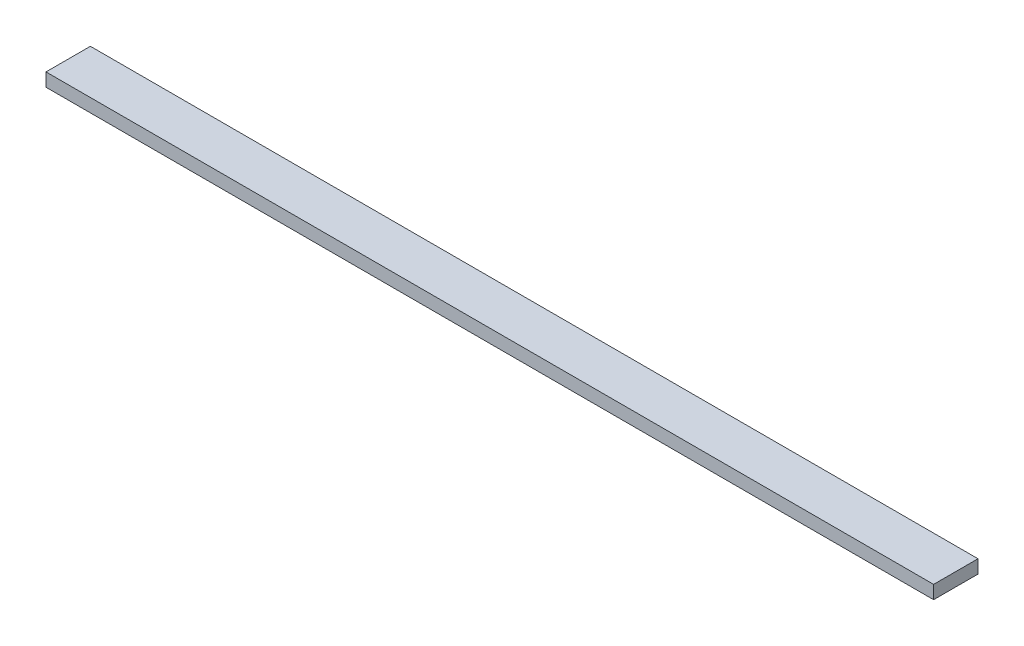
ISO-10303-21;
HEADER;
FILE_DESCRIPTION(('STEP AP214'),'2;1');
FILE_NAME('part.step','',(''),(''),'','','');
FILE_SCHEMA(('AUTOMOTIVE_DESIGN { 1 0 10303 214 1 1 1 1 }'));
ENDSEC;
DATA;
#1=APPLICATION_CONTEXT('core data for automotive mechanical design processes');
#2=APPLICATION_PROTOCOL_DEFINITION('international standard','automotive_design',2000,#1);
#3=PRODUCT_CONTEXT('',#1,'mechanical');
#4=PRODUCT('Part','Part','',(#3));
#5=PRODUCT_RELATED_PRODUCT_CATEGORY('part','',(#4));
#6=PRODUCT_DEFINITION_FORMATION('','',#4);
#7=PRODUCT_DEFINITION_CONTEXT('part definition',#1,'design');
#8=PRODUCT_DEFINITION('design','',#6,#7);
#9=PRODUCT_DEFINITION_SHAPE('','',#8);
#10=(LENGTH_UNIT() NAMED_UNIT(*) SI_UNIT(.MILLI.,.METRE.));
#11=(NAMED_UNIT(*) PLANE_ANGLE_UNIT() SI_UNIT($,.RADIAN.));
#12=(NAMED_UNIT(*) SI_UNIT($,.STERADIAN.) SOLID_ANGLE_UNIT());
#13=UNCERTAINTY_MEASURE_WITH_UNIT(LENGTH_MEASURE(1.E-05),#10,'distance_accuracy_value','');
#14=(GEOMETRIC_REPRESENTATION_CONTEXT(3) GLOBAL_UNCERTAINTY_ASSIGNED_CONTEXT((#13)) GLOBAL_UNIT_ASSIGNED_CONTEXT((#10,
#11,#12)) REPRESENTATION_CONTEXT('',''));
#15=CARTESIAN_POINT('',(0.,0.,0.));
#16=DIRECTION('',(0.,0.,1.));
#17=DIRECTION('',(1.,0.,0.));
#18=AXIS2_PLACEMENT_3D('',#15,#16,#17);
#19=CARTESIAN_POINT('',(100.,1.5,5.));
#20=DIRECTION('',(-1.,0.,0.));
#21=DIRECTION('',(0.,0.,1.));
#22=AXIS2_PLACEMENT_3D('',#19,#20,#21);
#23=PLANE('',#22);
#24=DIRECTION('',(0.,0.,-1.));
#25=VECTOR('',#24,1.);
#26=CARTESIAN_POINT('',(100.,-1.5,5.));
#27=LINE('',#26,#25);
#28=CARTESIAN_POINT('',(100.,-1.5,5.));
#29=VERTEX_POINT('',#28);
#30=CARTESIAN_POINT('',(100.,-1.5,-5.));
#31=VERTEX_POINT('',#30);
#32=EDGE_CURVE('E111',#29,#31,#27,.T.);
#33=ORIENTED_EDGE('',*,*,#32,.T.);
#34=DIRECTION('',(0.,-1.,0.));
#35=VECTOR('',#34,1.);
#36=CARTESIAN_POINT('',(100.,1.5,-5.));
#37=LINE('',#36,#35);
#38=CARTESIAN_POINT('',(100.,1.5,-5.));
#39=VERTEX_POINT('',#38);
#40=EDGE_CURVE('E11',#39,#31,#37,.T.);
#41=ORIENTED_EDGE('',*,*,#40,.F.);
#42=DIRECTION('',(0.,0.,-1.));
#43=VECTOR('',#42,1.);
#44=CARTESIAN_POINT('',(100.,1.5,5.));
#45=LINE('',#44,#43);
#46=CARTESIAN_POINT('',(100.,1.5,5.));
#47=VERTEX_POINT('',#46);
#48=EDGE_CURVE('E95',#47,#39,#45,.T.);
#49=ORIENTED_EDGE('',*,*,#48,.F.);
#50=DIRECTION('',(0.,-1.,0.));
#51=VECTOR('',#50,1.);
#52=CARTESIAN_POINT('',(100.,1.5,5.));
#53=LINE('',#52,#51);
#54=EDGE_CURVE('E107',#47,#29,#53,.T.);
#55=ORIENTED_EDGE('',*,*,#54,.T.);
#56=EDGE_LOOP('',(#33,#41,#49,#55));
#57=FACE_BOUND('',#56,.T.);
#58=ADVANCED_FACE('F43',(#57),#23,.F.);
#59=CARTESIAN_POINT('',(-99.9999999999998,1.5,-5.));
#60=DIRECTION('',(0.,0.,1.));
#61=DIRECTION('',(1.,0.,0.));
#62=AXIS2_PLACEMENT_3D('',#59,#60,#61);
#63=PLANE('',#62);
#64=DIRECTION('',(-1.,0.,0.));
#65=VECTOR('',#64,1.);
#66=CARTESIAN_POINT('',(-99.9999999999998,-1.5,-5.));
#67=LINE('',#66,#65);
#68=CARTESIAN_POINT('',(-99.9999999999998,-1.5,-5.));
#69=VERTEX_POINT('',#68);
#70=EDGE_CURVE('E100',#31,#69,#67,.T.);
#71=ORIENTED_EDGE('',*,*,#70,.T.);
#72=DIRECTION('',(0.,-1.,0.));
#73=VECTOR('',#72,1.);
#74=CARTESIAN_POINT('',(-99.9999999999998,1.5,-5.));
#75=LINE('',#74,#73);
#76=CARTESIAN_POINT('',(-99.9999999999998,1.5,-5.));
#77=VERTEX_POINT('',#76);
#78=EDGE_CURVE('E52',#77,#69,#75,.T.);
#79=ORIENTED_EDGE('',*,*,#78,.F.);
#80=DIRECTION('',(-1.,0.,0.));
#81=VECTOR('',#80,1.);
#82=CARTESIAN_POINT('',(-99.9999999999998,1.5,-5.));
#83=LINE('',#82,#81);
#84=EDGE_CURVE('E90',#39,#77,#83,.T.);
#85=ORIENTED_EDGE('',*,*,#84,.F.);
#86=ORIENTED_EDGE('',*,*,#40,.T.);
#87=EDGE_LOOP('',(#71,#79,#85,#86));
#88=FACE_BOUND('',#87,.T.);
#89=ADVANCED_FACE('F99',(#88),#63,.F.);
#90=CARTESIAN_POINT('',(-99.9999999999998,1.5,5.));
#91=DIRECTION('',(1.,0.,0.));
#92=DIRECTION('',(0.,0.,-1.));
#93=AXIS2_PLACEMENT_3D('',#90,#91,#92);
#94=PLANE('',#93);
#95=DIRECTION('',(0.,0.,1.));
#96=VECTOR('',#95,1.);
#97=CARTESIAN_POINT('',(-99.9999999999998,-1.5,5.));
#98=LINE('',#97,#96);
#99=CARTESIAN_POINT('',(-99.9999999999998,-1.5,5.));
#100=VERTEX_POINT('',#99);
#101=EDGE_CURVE('E77',#69,#100,#98,.T.);
#102=ORIENTED_EDGE('',*,*,#101,.T.);
#103=DIRECTION('',(0.,-1.,0.));
#104=VECTOR('',#103,1.);
#105=CARTESIAN_POINT('',(-99.9999999999998,1.5,5.));
#106=LINE('',#105,#104);
#107=CARTESIAN_POINT('',(-99.9999999999998,1.5,5.));
#108=VERTEX_POINT('',#107);
#109=EDGE_CURVE('E102',#108,#100,#106,.T.);
#110=ORIENTED_EDGE('',*,*,#109,.F.);
#111=DIRECTION('',(0.,0.,1.));
#112=VECTOR('',#111,1.);
#113=CARTESIAN_POINT('',(-99.9999999999998,1.5,5.));
#114=LINE('',#113,#112);
#115=EDGE_CURVE('E93',#77,#108,#114,.T.);
#116=ORIENTED_EDGE('',*,*,#115,.F.);
#117=ORIENTED_EDGE('',*,*,#78,.T.);
#118=EDGE_LOOP('',(#102,#110,#116,#117));
#119=FACE_BOUND('',#118,.T.);
#120=ADVANCED_FACE('F103',(#119),#94,.F.);
#121=CARTESIAN_POINT('',(-99.9999999999998,1.5,5.));
#122=DIRECTION('',(0.,0.,-1.));
#123=DIRECTION('',(-1.,0.,0.));
#124=AXIS2_PLACEMENT_3D('',#121,#122,#123);
#125=PLANE('',#124);
#126=DIRECTION('',(1.,0.,0.));
#127=VECTOR('',#126,1.);
#128=CARTESIAN_POINT('',(-99.9999999999998,-1.5,5.));
#129=LINE('',#128,#127);
#130=EDGE_CURVE('E83',#100,#29,#129,.T.);
#131=ORIENTED_EDGE('',*,*,#130,.T.);
#132=ORIENTED_EDGE('',*,*,#54,.F.);
#133=DIRECTION('',(1.,0.,0.));
#134=VECTOR('',#133,1.);
#135=CARTESIAN_POINT('',(-99.9999999999998,1.5,5.));
#136=LINE('',#135,#134);
#137=EDGE_CURVE('E60',#108,#47,#136,.T.);
#138=ORIENTED_EDGE('',*,*,#137,.F.);
#139=ORIENTED_EDGE('',*,*,#109,.T.);
#140=EDGE_LOOP('',(#131,#132,#138,#139));
#141=FACE_BOUND('',#140,.T.);
#142=ADVANCED_FACE('F124',(#141),#125,.F.);
#143=CARTESIAN_POINT('',(0.,1.5,0.));
#144=DIRECTION('',(0.,-1.,0.));
#145=DIRECTION('',(0.,0.,-1.));
#146=AXIS2_PLACEMENT_3D('',#143,#144,#145);
#147=PLANE('',#146);
#148=ORIENTED_EDGE('',*,*,#48,.T.);
#149=ORIENTED_EDGE('',*,*,#84,.T.);
#150=ORIENTED_EDGE('',*,*,#115,.T.);
#151=ORIENTED_EDGE('',*,*,#137,.T.);
#152=EDGE_LOOP('',(#148,#149,#150,#151));
#153=FACE_BOUND('',#152,.T.);
#154=ADVANCED_FACE('F91',(#153),#147,.F.);
#155=CARTESIAN_POINT('',(0.,-1.5,0.));
#156=DIRECTION('',(0.,-1.,0.));
#157=DIRECTION('',(0.,0.,-1.));
#158=AXIS2_PLACEMENT_3D('',#155,#156,#157);
#159=PLANE('',#158);
#160=ORIENTED_EDGE('',*,*,#32,.F.);
#161=ORIENTED_EDGE('',*,*,#130,.F.);
#162=ORIENTED_EDGE('',*,*,#101,.F.);
#163=ORIENTED_EDGE('',*,*,#70,.F.);
#164=EDGE_LOOP('',(#160,#161,#162,#163));
#165=FACE_BOUND('',#164,.T.);
#166=ADVANCED_FACE('F127',(#165),#159,.T.);
#167=CLOSED_SHELL('',(#58,#89,#120,#142,#154,#166));
#168=MANIFOLD_SOLID_BREP('B2',#167);
#169=ADVANCED_BREP_SHAPE_REPRESENTATION('',(#18,#168),#14);
#170=SHAPE_DEFINITION_REPRESENTATION(#9,#169);
ENDSEC;
END-ISO-10303-21;
